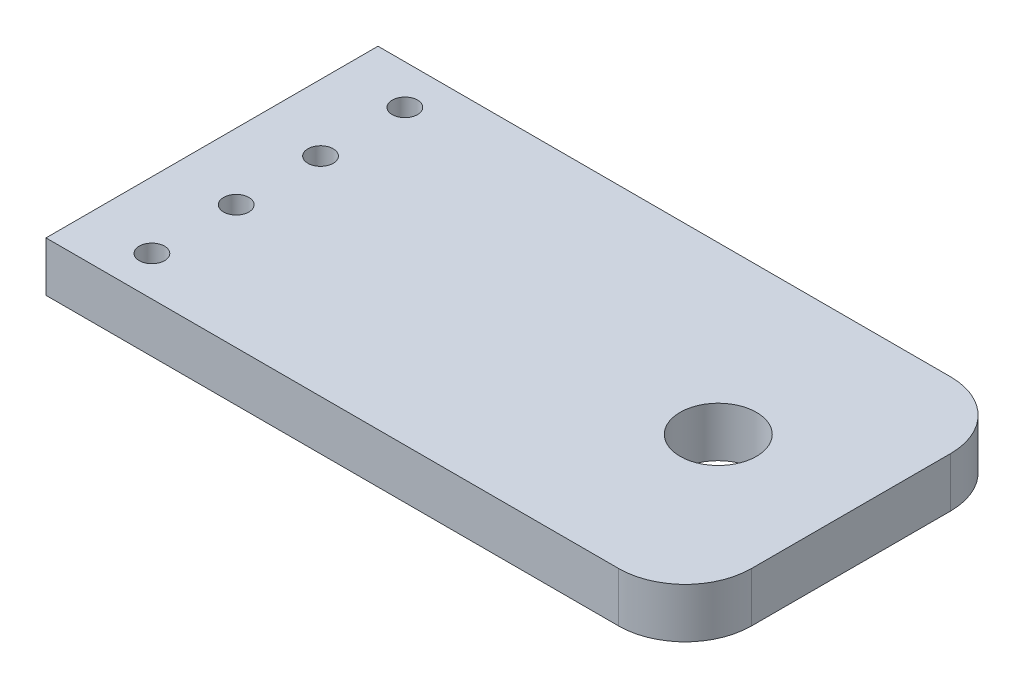
ISO-10303-21;
HEADER;
FILE_DESCRIPTION(('STEP AP214'),'2;1');
FILE_NAME('part.step','',(''),(''),'','','');
FILE_SCHEMA(('AUTOMOTIVE_DESIGN { 1 0 10303 214 1 1 1 1 }'));
ENDSEC;
DATA;
#1=APPLICATION_CONTEXT('core data for automotive mechanical design processes');
#2=APPLICATION_PROTOCOL_DEFINITION('international standard','automotive_design',2000,#1);
#3=PRODUCT_CONTEXT('',#1,'mechanical');
#4=PRODUCT('Part','Part','',(#3));
#5=PRODUCT_RELATED_PRODUCT_CATEGORY('part','',(#4));
#6=PRODUCT_DEFINITION_FORMATION('','',#4);
#7=PRODUCT_DEFINITION_CONTEXT('part definition',#1,'design');
#8=PRODUCT_DEFINITION('design','',#6,#7);
#9=PRODUCT_DEFINITION_SHAPE('','',#8);
#10=(LENGTH_UNIT() NAMED_UNIT(*) SI_UNIT(.MILLI.,.METRE.));
#11=(NAMED_UNIT(*) PLANE_ANGLE_UNIT() SI_UNIT($,.RADIAN.));
#12=(NAMED_UNIT(*) SI_UNIT($,.STERADIAN.) SOLID_ANGLE_UNIT());
#13=UNCERTAINTY_MEASURE_WITH_UNIT(LENGTH_MEASURE(1.E-05),#10,'distance_accuracy_value','');
#14=(GEOMETRIC_REPRESENTATION_CONTEXT(3) GLOBAL_UNCERTAINTY_ASSIGNED_CONTEXT((#13)) GLOBAL_UNIT_ASSIGNED_CONTEXT((#10,
#11,#12)) REPRESENTATION_CONTEXT('',''));
#15=CARTESIAN_POINT('',(0.,0.,0.));
#16=DIRECTION('',(0.,0.,1.));
#17=DIRECTION('',(1.,0.,0.));
#18=AXIS2_PLACEMENT_3D('',#15,#16,#17);
#19=CARTESIAN_POINT('',(0.,1.5,0.));
#20=DIRECTION('',(0.,-1.,0.));
#21=DIRECTION('',(0.,0.,-1.));
#22=AXIS2_PLACEMENT_3D('',#19,#20,#21);
#23=PLANE('',#22);
#24=DIRECTION('',(0.,0.,-1.));
#25=VECTOR('',#24,1.);
#26=CARTESIAN_POINT('',(19.25,1.5,0.));
#27=LINE('',#26,#25);
#28=CARTESIAN_POINT('',(19.25,1.5,-2.));
#29=VERTEX_POINT('',#28);
#30=CARTESIAN_POINT('',(19.25,1.5,-8.));
#31=VERTEX_POINT('',#30);
#32=EDGE_CURVE('E93',#29,#31,#27,.T.);
#33=ORIENTED_EDGE('',*,*,#32,.T.);
#34=CARTESIAN_POINT('',(17.25,1.5,-8.));
#35=DIRECTION('',(0.,-1.,0.));
#36=DIRECTION('',(0.,0.,-1.));
#37=AXIS2_PLACEMENT_3D('',#34,#35,#36);
#38=CIRCLE('',#37,2.);
#39=CARTESIAN_POINT('',(17.25,1.5,-10.));
#40=VERTEX_POINT('',#39);
#41=EDGE_CURVE('E41',#31,#40,#38,.F.);
#42=ORIENTED_EDGE('',*,*,#41,.T.);
#43=DIRECTION('',(-1.,0.,0.));
#44=VECTOR('',#43,1.);
#45=CARTESIAN_POINT('',(0.,1.5,-10.));
#46=LINE('',#45,#44);
#47=CARTESIAN_POINT('',(0.,1.5,-10.));
#48=VERTEX_POINT('',#47);
#49=EDGE_CURVE('E99',#40,#48,#46,.T.);
#50=ORIENTED_EDGE('',*,*,#49,.T.);
#51=DIRECTION('',(0.,0.,1.));
#52=VECTOR('',#51,1.);
#53=CARTESIAN_POINT('',(0.,1.5,0.));
#54=LINE('',#53,#52);
#55=CARTESIAN_POINT('',(0.,1.5,0.));
#56=VERTEX_POINT('',#55);
#57=EDGE_CURVE('E94',#48,#56,#54,.T.);
#58=ORIENTED_EDGE('',*,*,#57,.T.);
#59=DIRECTION('',(1.,0.,0.));
#60=VECTOR('',#59,1.);
#61=CARTESIAN_POINT('',(0.,1.5,0.));
#62=LINE('',#61,#60);
#63=CARTESIAN_POINT('',(17.25,1.5,0.));
#64=VERTEX_POINT('',#63);
#65=EDGE_CURVE('E85',#56,#64,#62,.T.);
#66=ORIENTED_EDGE('',*,*,#65,.T.);
#67=CARTESIAN_POINT('',(17.25,1.5,-2.));
#68=DIRECTION('',(0.,-1.,0.));
#69=DIRECTION('',(0.,0.,-1.));
#70=AXIS2_PLACEMENT_3D('',#67,#68,#69);
#71=CIRCLE('',#70,2.);
#72=EDGE_CURVE('E124',#64,#29,#71,.F.);
#73=ORIENTED_EDGE('',*,*,#72,.T.);
#74=EDGE_LOOP('',(#33,#42,#50,#58,#66,#73));
#75=FACE_BOUND('',#74,.T.);
#76=CARTESIAN_POINT('',(15.25,1.5,-5.));
#77=DIRECTION('',(0.,1.,0.));
#78=DIRECTION('',(0.,0.,1.));
#79=AXIS2_PLACEMENT_3D('',#76,#77,#78);
#80=CIRCLE('',#79,1.15);
#81=CARTESIAN_POINT('',(15.25,1.5,-3.85));
#82=VERTEX_POINT('',#81);
#83=EDGE_CURVE('E144',#82,#82,#80,.T.);
#84=ORIENTED_EDGE('',*,*,#83,.F.);
#85=EDGE_LOOP('',(#84));
#86=FACE_BOUND('',#85,.T.);
#87=CARTESIAN_POINT('',(2.,1.5,-6.27));
#88=DIRECTION('',(0.,1.,0.));
#89=DIRECTION('',(0.,0.,1.));
#90=AXIS2_PLACEMENT_3D('',#87,#88,#89);
#91=CIRCLE('',#90,0.381);
#92=CARTESIAN_POINT('',(2.,1.5,-5.889));
#93=VERTEX_POINT('',#92);
#94=EDGE_CURVE('E150',#93,#93,#91,.T.);
#95=ORIENTED_EDGE('',*,*,#94,.F.);
#96=EDGE_LOOP('',(#95));
#97=FACE_BOUND('',#96,.T.);
#98=CARTESIAN_POINT('',(2.,1.5,-3.73));
#99=DIRECTION('',(0.,1.,0.));
#100=DIRECTION('',(0.,0.,1.));
#101=AXIS2_PLACEMENT_3D('',#98,#99,#100);
#102=CIRCLE('',#101,0.381);
#103=CARTESIAN_POINT('',(2.,1.5,-3.349));
#104=VERTEX_POINT('',#103);
#105=EDGE_CURVE('E156',#104,#104,#102,.T.);
#106=ORIENTED_EDGE('',*,*,#105,.F.);
#107=EDGE_LOOP('',(#106));
#108=FACE_BOUND('',#107,.T.);
#109=CARTESIAN_POINT('',(2.,1.5,-1.19));
#110=DIRECTION('',(0.,1.,0.));
#111=DIRECTION('',(0.,0.,1.));
#112=AXIS2_PLACEMENT_3D('',#109,#110,#111);
#113=CIRCLE('',#112,0.381);
#114=CARTESIAN_POINT('',(2.,1.5,-0.809));
#115=VERTEX_POINT('',#114);
#116=EDGE_CURVE('E162',#115,#115,#113,.T.);
#117=ORIENTED_EDGE('',*,*,#116,.F.);
#118=EDGE_LOOP('',(#117));
#119=FACE_BOUND('',#118,.T.);
#120=CARTESIAN_POINT('',(2.,1.5,-8.81));
#121=DIRECTION('',(0.,1.,0.));
#122=DIRECTION('',(0.,0.,1.));
#123=AXIS2_PLACEMENT_3D('',#120,#121,#122);
#124=CIRCLE('',#123,0.381);
#125=CARTESIAN_POINT('',(2.,1.5,-8.429));
#126=VERTEX_POINT('',#125);
#127=EDGE_CURVE('E168',#126,#126,#124,.T.);
#128=ORIENTED_EDGE('',*,*,#127,.F.);
#129=EDGE_LOOP('',(#128));
#130=FACE_BOUND('',#129,.T.);
#131=ADVANCED_FACE('F33',(#75,#86,#97,#108,#119,#130),#23,.F.);
#132=CARTESIAN_POINT('',(0.,0.,0.));
#133=DIRECTION('',(0.,-1.,0.));
#134=DIRECTION('',(0.,0.,-1.));
#135=AXIS2_PLACEMENT_3D('',#132,#133,#134);
#136=PLANE('',#135);
#137=CARTESIAN_POINT('',(2.,0.,-1.19));
#138=DIRECTION('',(0.,1.,0.));
#139=DIRECTION('',(0.,0.,1.));
#140=AXIS2_PLACEMENT_3D('',#137,#138,#139);
#141=CIRCLE('',#140,0.381);
#142=CARTESIAN_POINT('',(2.,0.,-0.809));
#143=VERTEX_POINT('',#142);
#144=EDGE_CURVE('E165',#143,#143,#141,.T.);
#145=ORIENTED_EDGE('',*,*,#144,.T.);
#146=EDGE_LOOP('',(#145));
#147=FACE_BOUND('',#146,.T.);
#148=CARTESIAN_POINT('',(2.,0.,-6.27));
#149=DIRECTION('',(0.,1.,0.));
#150=DIRECTION('',(0.,0.,1.));
#151=AXIS2_PLACEMENT_3D('',#148,#149,#150);
#152=CIRCLE('',#151,0.381);
#153=CARTESIAN_POINT('',(2.,0.,-5.889));
#154=VERTEX_POINT('',#153);
#155=EDGE_CURVE('E153',#154,#154,#152,.T.);
#156=ORIENTED_EDGE('',*,*,#155,.T.);
#157=EDGE_LOOP('',(#156));
#158=FACE_BOUND('',#157,.T.);
#159=DIRECTION('',(-1.,0.,0.));
#160=VECTOR('',#159,1.);
#161=CARTESIAN_POINT('',(0.,0.,-10.));
#162=LINE('',#161,#160);
#163=CARTESIAN_POINT('',(17.25,0.,-10.));
#164=VERTEX_POINT('',#163);
#165=CARTESIAN_POINT('',(0.,0.,-10.));
#166=VERTEX_POINT('',#165);
#167=EDGE_CURVE('E103',#164,#166,#162,.T.);
#168=ORIENTED_EDGE('',*,*,#167,.F.);
#169=CARTESIAN_POINT('',(17.25,0.,-8.));
#170=DIRECTION('',(0.,-1.,0.));
#171=DIRECTION('',(0.,0.,-1.));
#172=AXIS2_PLACEMENT_3D('',#169,#170,#171);
#173=CIRCLE('',#172,2.);
#174=CARTESIAN_POINT('',(19.25,0.,-8.));
#175=VERTEX_POINT('',#174);
#176=EDGE_CURVE('E118',#164,#175,#173,.T.);
#177=ORIENTED_EDGE('',*,*,#176,.T.);
#178=DIRECTION('',(0.,0.,-1.));
#179=VECTOR('',#178,1.);
#180=CARTESIAN_POINT('',(19.25,0.,0.));
#181=LINE('',#180,#179);
#182=CARTESIAN_POINT('',(19.25,0.,-2.));
#183=VERTEX_POINT('',#182);
#184=EDGE_CURVE('E137',#183,#175,#181,.T.);
#185=ORIENTED_EDGE('',*,*,#184,.F.);
#186=CARTESIAN_POINT('',(17.25,0.,-2.));
#187=DIRECTION('',(0.,-1.,0.));
#188=DIRECTION('',(0.,0.,-1.));
#189=AXIS2_PLACEMENT_3D('',#186,#187,#188);
#190=CIRCLE('',#189,2.);
#191=CARTESIAN_POINT('',(17.25,0.,0.));
#192=VERTEX_POINT('',#191);
#193=EDGE_CURVE('E112',#183,#192,#190,.T.);
#194=ORIENTED_EDGE('',*,*,#193,.T.);
#195=DIRECTION('',(1.,0.,0.));
#196=VECTOR('',#195,1.);
#197=CARTESIAN_POINT('',(0.,0.,0.));
#198=LINE('',#197,#196);
#199=CARTESIAN_POINT('',(0.,0.,0.));
#200=VERTEX_POINT('',#199);
#201=EDGE_CURVE('E140',#200,#192,#198,.T.);
#202=ORIENTED_EDGE('',*,*,#201,.F.);
#203=DIRECTION('',(0.,0.,1.));
#204=VECTOR('',#203,1.);
#205=CARTESIAN_POINT('',(0.,0.,0.));
#206=LINE('',#205,#204);
#207=EDGE_CURVE('E107',#166,#200,#206,.T.);
#208=ORIENTED_EDGE('',*,*,#207,.F.);
#209=EDGE_LOOP('',(#168,#177,#185,#194,#202,#208));
#210=FACE_BOUND('',#209,.T.);
#211=CARTESIAN_POINT('',(15.25,0.,-5.));
#212=DIRECTION('',(0.,1.,0.));
#213=DIRECTION('',(0.,0.,1.));
#214=AXIS2_PLACEMENT_3D('',#211,#212,#213);
#215=CIRCLE('',#214,1.15);
#216=CARTESIAN_POINT('',(15.25,0.,-3.85));
#217=VERTEX_POINT('',#216);
#218=EDGE_CURVE('E147',#217,#217,#215,.T.);
#219=ORIENTED_EDGE('',*,*,#218,.T.);
#220=EDGE_LOOP('',(#219));
#221=FACE_BOUND('',#220,.T.);
#222=CARTESIAN_POINT('',(2.,0.,-3.73));
#223=DIRECTION('',(0.,1.,0.));
#224=DIRECTION('',(0.,0.,1.));
#225=AXIS2_PLACEMENT_3D('',#222,#223,#224);
#226=CIRCLE('',#225,0.381);
#227=CARTESIAN_POINT('',(2.,0.,-3.349));
#228=VERTEX_POINT('',#227);
#229=EDGE_CURVE('E159',#228,#228,#226,.T.);
#230=ORIENTED_EDGE('',*,*,#229,.T.);
#231=EDGE_LOOP('',(#230));
#232=FACE_BOUND('',#231,.T.);
#233=CARTESIAN_POINT('',(2.,0.,-8.81));
#234=DIRECTION('',(0.,1.,0.));
#235=DIRECTION('',(0.,0.,1.));
#236=AXIS2_PLACEMENT_3D('',#233,#234,#235);
#237=CIRCLE('',#236,0.381);
#238=CARTESIAN_POINT('',(2.,0.,-8.429));
#239=VERTEX_POINT('',#238);
#240=EDGE_CURVE('E171',#239,#239,#237,.T.);
#241=ORIENTED_EDGE('',*,*,#240,.T.);
#242=EDGE_LOOP('',(#241));
#243=FACE_BOUND('',#242,.T.);
#244=ADVANCED_FACE('F135',(#147,#158,#210,#221,#232,#243),#136,.T.);
#245=CARTESIAN_POINT('',(0.,1.5,0.));
#246=DIRECTION('',(1.,0.,0.));
#247=DIRECTION('',(0.,0.,-1.));
#248=AXIS2_PLACEMENT_3D('',#245,#246,#247);
#249=PLANE('',#248);
#250=ORIENTED_EDGE('',*,*,#207,.T.);
#251=DIRECTION('',(0.,-1.,0.));
#252=VECTOR('',#251,1.);
#253=CARTESIAN_POINT('',(0.,1.5,0.));
#254=LINE('',#253,#252);
#255=EDGE_CURVE('E89',#56,#200,#254,.T.);
#256=ORIENTED_EDGE('',*,*,#255,.F.);
#257=ORIENTED_EDGE('',*,*,#57,.F.);
#258=DIRECTION('',(0.,-1.,0.));
#259=VECTOR('',#258,1.);
#260=CARTESIAN_POINT('',(0.,1.5,-10.));
#261=LINE('',#260,#259);
#262=EDGE_CURVE('E109',#48,#166,#261,.T.);
#263=ORIENTED_EDGE('',*,*,#262,.T.);
#264=EDGE_LOOP('',(#250,#256,#257,#263));
#265=FACE_BOUND('',#264,.T.);
#266=ADVANCED_FACE('F105',(#265),#249,.F.);
#267=CARTESIAN_POINT('',(0.,1.5,0.));
#268=DIRECTION('',(0.,0.,-1.));
#269=DIRECTION('',(-1.,0.,0.));
#270=AXIS2_PLACEMENT_3D('',#267,#268,#269);
#271=PLANE('',#270);
#272=ORIENTED_EDGE('',*,*,#201,.T.);
#273=DIRECTION('',(0.,-1.,0.));
#274=VECTOR('',#273,1.);
#275=CARTESIAN_POINT('',(17.25,1.5,0.));
#276=LINE('',#275,#274);
#277=EDGE_CURVE('E11',#192,#64,#276,.F.);
#278=ORIENTED_EDGE('',*,*,#277,.T.);
#279=ORIENTED_EDGE('',*,*,#65,.F.);
#280=ORIENTED_EDGE('',*,*,#255,.T.);
#281=EDGE_LOOP('',(#272,#278,#279,#280));
#282=FACE_BOUND('',#281,.T.);
#283=ADVANCED_FACE('F87',(#282),#271,.F.);
#284=CARTESIAN_POINT('',(19.25,1.5,0.));
#285=DIRECTION('',(-1.,0.,0.));
#286=DIRECTION('',(0.,0.,1.));
#287=AXIS2_PLACEMENT_3D('',#284,#285,#286);
#288=PLANE('',#287);
#289=ORIENTED_EDGE('',*,*,#184,.T.);
#290=DIRECTION('',(0.,-1.,0.));
#291=VECTOR('',#290,1.);
#292=CARTESIAN_POINT('',(19.25,1.5,-8.));
#293=LINE('',#292,#291);
#294=EDGE_CURVE('E54',#175,#31,#293,.F.);
#295=ORIENTED_EDGE('',*,*,#294,.T.);
#296=ORIENTED_EDGE('',*,*,#32,.F.);
#297=DIRECTION('',(0.,-1.,0.));
#298=VECTOR('',#297,1.);
#299=CARTESIAN_POINT('',(19.25,1.5,-2.));
#300=LINE('',#299,#298);
#301=EDGE_CURVE('E120',#29,#183,#300,.T.);
#302=ORIENTED_EDGE('',*,*,#301,.T.);
#303=EDGE_LOOP('',(#289,#295,#296,#302));
#304=FACE_BOUND('',#303,.T.);
#305=ADVANCED_FACE('F138',(#304),#288,.F.);
#306=CARTESIAN_POINT('',(0.,1.5,-10.));
#307=DIRECTION('',(0.,0.,1.));
#308=DIRECTION('',(1.,0.,0.));
#309=AXIS2_PLACEMENT_3D('',#306,#307,#308);
#310=PLANE('',#309);
#311=ORIENTED_EDGE('',*,*,#49,.F.);
#312=DIRECTION('',(0.,-1.,0.));
#313=VECTOR('',#312,1.);
#314=CARTESIAN_POINT('',(17.25,1.5,-10.));
#315=LINE('',#314,#313);
#316=EDGE_CURVE('E108',#40,#164,#315,.T.);
#317=ORIENTED_EDGE('',*,*,#316,.T.);
#318=ORIENTED_EDGE('',*,*,#167,.T.);
#319=ORIENTED_EDGE('',*,*,#262,.F.);
#320=EDGE_LOOP('',(#311,#317,#318,#319));
#321=FACE_BOUND('',#320,.T.);
#322=ADVANCED_FACE('F129',(#321),#310,.F.);
#323=CARTESIAN_POINT('',(15.25,1.5,-5.));
#324=DIRECTION('',(0.,-1.,0.));
#325=DIRECTION('',(0.,0.,-1.));
#326=AXIS2_PLACEMENT_3D('',#323,#324,#325);
#327=CYLINDRICAL_SURFACE('',#326,1.15);
#328=ORIENTED_EDGE('',*,*,#83,.T.);
#329=EDGE_LOOP('',(#328));
#330=FACE_BOUND('',#329,.T.);
#331=ORIENTED_EDGE('',*,*,#218,.F.);
#332=EDGE_LOOP('',(#331));
#333=FACE_BOUND('',#332,.T.);
#334=ADVANCED_FACE('F188',(#330,#333),#327,.F.);
#335=CARTESIAN_POINT('',(2.,1.5,-6.27));
#336=DIRECTION('',(0.,-1.,0.));
#337=DIRECTION('',(0.,0.,-1.));
#338=AXIS2_PLACEMENT_3D('',#335,#336,#337);
#339=CYLINDRICAL_SURFACE('',#338,0.381);
#340=ORIENTED_EDGE('',*,*,#94,.T.);
#341=EDGE_LOOP('',(#340));
#342=FACE_BOUND('',#341,.T.);
#343=ORIENTED_EDGE('',*,*,#155,.F.);
#344=EDGE_LOOP('',(#343));
#345=FACE_BOUND('',#344,.T.);
#346=ADVANCED_FACE('F214',(#342,#345),#339,.F.);
#347=CARTESIAN_POINT('',(2.,1.5,-3.73));
#348=DIRECTION('',(0.,-1.,0.));
#349=DIRECTION('',(0.,0.,-1.));
#350=AXIS2_PLACEMENT_3D('',#347,#348,#349);
#351=CYLINDRICAL_SURFACE('',#350,0.381);
#352=ORIENTED_EDGE('',*,*,#105,.T.);
#353=EDGE_LOOP('',(#352));
#354=FACE_BOUND('',#353,.T.);
#355=ORIENTED_EDGE('',*,*,#229,.F.);
#356=EDGE_LOOP('',(#355));
#357=FACE_BOUND('',#356,.T.);
#358=ADVANCED_FACE('F209',(#354,#357),#351,.F.);
#359=CARTESIAN_POINT('',(2.,1.5,-1.19));
#360=DIRECTION('',(0.,-1.,0.));
#361=DIRECTION('',(0.,0.,-1.));
#362=AXIS2_PLACEMENT_3D('',#359,#360,#361);
#363=CYLINDRICAL_SURFACE('',#362,0.381);
#364=ORIENTED_EDGE('',*,*,#116,.T.);
#365=EDGE_LOOP('',(#364));
#366=FACE_BOUND('',#365,.T.);
#367=ORIENTED_EDGE('',*,*,#144,.F.);
#368=EDGE_LOOP('',(#367));
#369=FACE_BOUND('',#368,.T.);
#370=ADVANCED_FACE('F204',(#366,#369),#363,.F.);
#371=CARTESIAN_POINT('',(2.,1.5,-8.81));
#372=DIRECTION('',(0.,-1.,0.));
#373=DIRECTION('',(0.,0.,-1.));
#374=AXIS2_PLACEMENT_3D('',#371,#372,#373);
#375=CYLINDRICAL_SURFACE('',#374,0.381);
#376=ORIENTED_EDGE('',*,*,#127,.T.);
#377=EDGE_LOOP('',(#376));
#378=FACE_BOUND('',#377,.T.);
#379=ORIENTED_EDGE('',*,*,#240,.F.);
#380=EDGE_LOOP('',(#379));
#381=FACE_BOUND('',#380,.T.);
#382=ADVANCED_FACE('F177',(#378,#381),#375,.F.);
#383=CARTESIAN_POINT('',(17.25,1.5,-8.));
#384=DIRECTION('',(0.,-1.,0.));
#385=DIRECTION('',(0.,0.,-1.));
#386=AXIS2_PLACEMENT_3D('',#383,#384,#385);
#387=CYLINDRICAL_SURFACE('',#386,2.);
#388=ORIENTED_EDGE('',*,*,#41,.F.);
#389=ORIENTED_EDGE('',*,*,#294,.F.);
#390=ORIENTED_EDGE('',*,*,#176,.F.);
#391=ORIENTED_EDGE('',*,*,#316,.F.);
#392=EDGE_LOOP('',(#388,#389,#390,#391));
#393=FACE_BOUND('',#392,.T.);
#394=ADVANCED_FACE('F132',(#393),#387,.T.);
#395=CARTESIAN_POINT('',(17.25,1.5,-2.));
#396=DIRECTION('',(0.,-1.,0.));
#397=DIRECTION('',(0.,0.,-1.));
#398=AXIS2_PLACEMENT_3D('',#395,#396,#397);
#399=CYLINDRICAL_SURFACE('',#398,2.);
#400=ORIENTED_EDGE('',*,*,#72,.F.);
#401=ORIENTED_EDGE('',*,*,#277,.F.);
#402=ORIENTED_EDGE('',*,*,#193,.F.);
#403=ORIENTED_EDGE('',*,*,#301,.F.);
#404=EDGE_LOOP('',(#400,#401,#402,#403));
#405=FACE_BOUND('',#404,.T.);
#406=ADVANCED_FACE('F35',(#405),#399,.T.);
#407=CLOSED_SHELL('',(#131,#244,#266,#283,#305,#322,#334,#346,#358,#370,#382,#394,#406));
#408=MANIFOLD_SOLID_BREP('B2',#407);
#409=ADVANCED_BREP_SHAPE_REPRESENTATION('',(#18,#408),#14);
#410=SHAPE_DEFINITION_REPRESENTATION(#9,#409);
ENDSEC;
END-ISO-10303-21;
